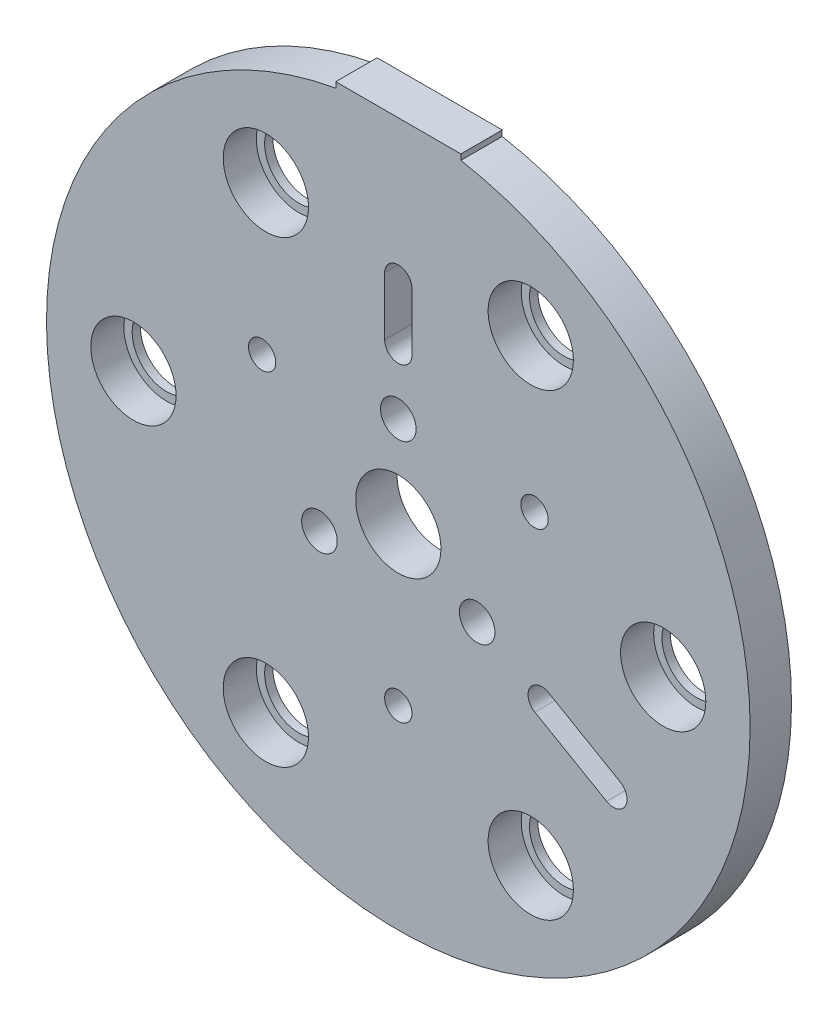
ISO-10303-21;
HEADER;
FILE_DESCRIPTION(('STEP AP214'),'2;1');
FILE_NAME('part.step','',(''),(''),'','','');
FILE_SCHEMA(('AUTOMOTIVE_DESIGN { 1 0 10303 214 1 1 1 1 }'));
ENDSEC;
DATA;
#1=APPLICATION_CONTEXT('core data for automotive mechanical design processes');
#2=APPLICATION_PROTOCOL_DEFINITION('international standard','automotive_design',2000,#1);
#3=PRODUCT_CONTEXT('',#1,'mechanical');
#4=PRODUCT('Part','Part','',(#3));
#5=PRODUCT_RELATED_PRODUCT_CATEGORY('part','',(#4));
#6=PRODUCT_DEFINITION_FORMATION('','',#4);
#7=PRODUCT_DEFINITION_CONTEXT('part definition',#1,'design');
#8=PRODUCT_DEFINITION('design','',#6,#7);
#9=PRODUCT_DEFINITION_SHAPE('','',#8);
#10=(LENGTH_UNIT() NAMED_UNIT(*) SI_UNIT(.MILLI.,.METRE.));
#11=(NAMED_UNIT(*) PLANE_ANGLE_UNIT() SI_UNIT($,.RADIAN.));
#12=(NAMED_UNIT(*) SI_UNIT($,.STERADIAN.) SOLID_ANGLE_UNIT());
#13=UNCERTAINTY_MEASURE_WITH_UNIT(LENGTH_MEASURE(1.E-05),#10,'distance_accuracy_value','');
#14=(GEOMETRIC_REPRESENTATION_CONTEXT(3) GLOBAL_UNCERTAINTY_ASSIGNED_CONTEXT((#13)) GLOBAL_UNIT_ASSIGNED_CONTEXT((#10,
#11,#12)) REPRESENTATION_CONTEXT('',''));
#15=CARTESIAN_POINT('',(0.,0.,0.));
#16=DIRECTION('',(0.,0.,1.));
#17=DIRECTION('',(1.,0.,0.));
#18=AXIS2_PLACEMENT_3D('',#15,#16,#17);
#19=CARTESIAN_POINT('',(0.,0.,-5.));
#20=DIRECTION('',(0.,0.,1.));
#21=DIRECTION('',(1.,0.,0.));
#22=AXIS2_PLACEMENT_3D('',#19,#20,#21);
#23=CYLINDRICAL_SURFACE('',#22,42.5);
#24=CARTESIAN_POINT('',(0.,0.,-5.));
#25=DIRECTION('',(0.,0.,1.));
#26=DIRECTION('',(1.,0.,0.));
#27=AXIS2_PLACEMENT_3D('',#24,#25,#26);
#28=CIRCLE('',#27,42.5);
#29=CARTESIAN_POINT('',(-7.55619707697775,41.8228871042385,-5.));
#30=VERTEX_POINT('',#29);
#31=CARTESIAN_POINT('',(7.55619707697775,41.8228871042385,-5.));
#32=VERTEX_POINT('',#31);
#33=EDGE_CURVE('E358',#30,#32,#28,.T.);
#34=ORIENTED_EDGE('',*,*,#33,.T.);
#35=DIRECTION('',(0.,0.,1.));
#36=VECTOR('',#35,1.);
#37=CARTESIAN_POINT('',(7.55619707697775,41.8228871042385,-5.));
#38=LINE('',#37,#36);
#39=CARTESIAN_POINT('',(7.55619707697775,41.8228871042385,0.));
#40=VERTEX_POINT('',#39);
#41=EDGE_CURVE('E192',#32,#40,#38,.T.);
#42=ORIENTED_EDGE('',*,*,#41,.T.);
#43=CARTESIAN_POINT('',(0.,0.,0.));
#44=DIRECTION('',(0.,0.,1.));
#45=DIRECTION('',(1.,0.,0.));
#46=AXIS2_PLACEMENT_3D('',#43,#44,#45);
#47=CIRCLE('',#46,42.5);
#48=CARTESIAN_POINT('',(-7.55619707697775,41.8228871042385,0.));
#49=VERTEX_POINT('',#48);
#50=EDGE_CURVE('E343',#49,#40,#47,.T.);
#51=ORIENTED_EDGE('',*,*,#50,.F.);
#52=DIRECTION('',(0.,0.,1.));
#53=VECTOR('',#52,1.);
#54=CARTESIAN_POINT('',(-7.55619707697775,41.8228871042385,-5.));
#55=LINE('',#54,#53);
#56=EDGE_CURVE('E190',#49,#30,#55,.F.);
#57=ORIENTED_EDGE('',*,*,#56,.T.);
#58=EDGE_LOOP('',(#34,#42,#51,#57));
#59=FACE_BOUND('',#58,.T.);
#60=ADVANCED_FACE('F79',(#59),#23,.T.);
#61=CARTESIAN_POINT('',(32.,0.,-5.));
#62=DIRECTION('',(0.,0.,1.));
#63=DIRECTION('',(1.,0.,0.));
#64=AXIS2_PLACEMENT_3D('',#61,#62,#63);
#65=CYLINDRICAL_SURFACE('',#64,5.15);
#66=CARTESIAN_POINT('',(32.,0.,0.));
#67=DIRECTION('',(0.,0.,1.));
#68=DIRECTION('',(1.,0.,0.));
#69=AXIS2_PLACEMENT_3D('',#66,#67,#68);
#70=CIRCLE('',#69,5.15);
#71=CARTESIAN_POINT('',(37.15,0.,0.));
#72=VERTEX_POINT('',#71);
#73=EDGE_CURVE('E353',#72,#72,#70,.T.);
#74=ORIENTED_EDGE('',*,*,#73,.T.);
#75=EDGE_LOOP('',(#74));
#76=FACE_BOUND('',#75,.T.);
#77=CARTESIAN_POINT('',(32.,0.,-4.));
#78=DIRECTION('',(0.,0.,-1.));
#79=DIRECTION('',(-1.,0.,0.));
#80=AXIS2_PLACEMENT_3D('',#77,#78,#79);
#81=CIRCLE('',#80,5.15);
#82=CARTESIAN_POINT('',(26.85,0.,-4.));
#83=VERTEX_POINT('',#82);
#84=EDGE_CURVE('E12',#83,#83,#81,.F.);
#85=ORIENTED_EDGE('',*,*,#84,.F.);
#86=EDGE_LOOP('',(#85));
#87=FACE_BOUND('',#86,.T.);
#88=ADVANCED_FACE('F381',(#76,#87),#65,.F.);
#89=CARTESIAN_POINT('',(16.,-27.712812921102,-5.));
#90=DIRECTION('',(0.,0.,1.));
#91=DIRECTION('',(1.,0.,0.));
#92=AXIS2_PLACEMENT_3D('',#89,#90,#91);
#93=CYLINDRICAL_SURFACE('',#92,5.15);
#94=CARTESIAN_POINT('',(16.,-27.712812921102,0.));
#95=DIRECTION('',(0.,0.,1.));
#96=DIRECTION('',(1.,0.,0.));
#97=AXIS2_PLACEMENT_3D('',#94,#95,#96);
#98=CIRCLE('',#97,5.15);
#99=CARTESIAN_POINT('',(21.15,-27.712812921102,0.));
#100=VERTEX_POINT('',#99);
#101=EDGE_CURVE('E347',#100,#100,#98,.T.);
#102=ORIENTED_EDGE('',*,*,#101,.T.);
#103=EDGE_LOOP('',(#102));
#104=FACE_BOUND('',#103,.T.);
#105=CARTESIAN_POINT('',(16.,-27.712812921102,-4.));
#106=DIRECTION('',(0.,0.,-1.));
#107=DIRECTION('',(-1.,0.,0.));
#108=AXIS2_PLACEMENT_3D('',#105,#106,#107);
#109=CIRCLE('',#108,5.15);
#110=CARTESIAN_POINT('',(10.85,-27.712812921102,-4.));
#111=VERTEX_POINT('',#110);
#112=EDGE_CURVE('E86',#111,#111,#109,.F.);
#113=ORIENTED_EDGE('',*,*,#112,.F.);
#114=EDGE_LOOP('',(#113));
#115=FACE_BOUND('',#114,.T.);
#116=ADVANCED_FACE('F378',(#104,#115),#93,.F.);
#117=CARTESIAN_POINT('',(-16.,-27.712812921102,-5.));
#118=DIRECTION('',(0.,0.,1.));
#119=DIRECTION('',(1.,0.,0.));
#120=AXIS2_PLACEMENT_3D('',#117,#118,#119);
#121=CYLINDRICAL_SURFACE('',#120,5.15);
#122=CARTESIAN_POINT('',(-16.,-27.712812921102,0.));
#123=DIRECTION('',(0.,0.,1.));
#124=DIRECTION('',(1.,0.,0.));
#125=AXIS2_PLACEMENT_3D('',#122,#123,#124);
#126=CIRCLE('',#125,5.15);
#127=CARTESIAN_POINT('',(-10.85,-27.712812921102,0.));
#128=VERTEX_POINT('',#127);
#129=EDGE_CURVE('E337',#128,#128,#126,.T.);
#130=ORIENTED_EDGE('',*,*,#129,.T.);
#131=EDGE_LOOP('',(#130));
#132=FACE_BOUND('',#131,.T.);
#133=CARTESIAN_POINT('',(-16.,-27.712812921102,-4.));
#134=DIRECTION('',(0.,0.,-1.));
#135=DIRECTION('',(-1.,0.,0.));
#136=AXIS2_PLACEMENT_3D('',#133,#134,#135);
#137=CIRCLE('',#136,5.15);
#138=CARTESIAN_POINT('',(-21.15,-27.712812921102,-4.));
#139=VERTEX_POINT('',#138);
#140=EDGE_CURVE('E371',#139,#139,#137,.F.);
#141=ORIENTED_EDGE('',*,*,#140,.F.);
#142=EDGE_LOOP('',(#141));
#143=FACE_BOUND('',#142,.T.);
#144=ADVANCED_FACE('F380',(#132,#143),#121,.F.);
#145=CARTESIAN_POINT('',(-32.,0.,-5.));
#146=DIRECTION('',(0.,0.,1.));
#147=DIRECTION('',(1.,0.,0.));
#148=AXIS2_PLACEMENT_3D('',#145,#146,#147);
#149=CYLINDRICAL_SURFACE('',#148,5.15);
#150=CARTESIAN_POINT('',(-32.,0.,0.));
#151=DIRECTION('',(0.,0.,1.));
#152=DIRECTION('',(1.,0.,0.));
#153=AXIS2_PLACEMENT_3D('',#150,#151,#152);
#154=CIRCLE('',#153,5.15);
#155=CARTESIAN_POINT('',(-26.85,0.,0.));
#156=VERTEX_POINT('',#155);
#157=EDGE_CURVE('E340',#156,#156,#154,.T.);
#158=ORIENTED_EDGE('',*,*,#157,.T.);
#159=EDGE_LOOP('',(#158));
#160=FACE_BOUND('',#159,.T.);
#161=CARTESIAN_POINT('',(-32.,0.,-4.));
#162=DIRECTION('',(0.,0.,-1.));
#163=DIRECTION('',(-1.,0.,0.));
#164=AXIS2_PLACEMENT_3D('',#161,#162,#163);
#165=CIRCLE('',#164,5.15);
#166=CARTESIAN_POINT('',(-37.15,0.,-4.));
#167=VERTEX_POINT('',#166);
#168=EDGE_CURVE('E368',#167,#167,#165,.F.);
#169=ORIENTED_EDGE('',*,*,#168,.F.);
#170=EDGE_LOOP('',(#169));
#171=FACE_BOUND('',#170,.T.);
#172=ADVANCED_FACE('F388',(#160,#171),#149,.F.);
#173=CARTESIAN_POINT('',(-16.,27.712812921102,-5.));
#174=DIRECTION('',(0.,0.,1.));
#175=DIRECTION('',(1.,0.,0.));
#176=AXIS2_PLACEMENT_3D('',#173,#174,#175);
#177=CYLINDRICAL_SURFACE('',#176,5.15);
#178=CARTESIAN_POINT('',(-16.,27.712812921102,0.));
#179=DIRECTION('',(0.,0.,1.));
#180=DIRECTION('',(1.,0.,0.));
#181=AXIS2_PLACEMENT_3D('',#178,#179,#180);
#182=CIRCLE('',#181,5.15);
#183=CARTESIAN_POINT('',(-10.85,27.712812921102,0.));
#184=VERTEX_POINT('',#183);
#185=EDGE_CURVE('E344',#184,#184,#182,.T.);
#186=ORIENTED_EDGE('',*,*,#185,.T.);
#187=EDGE_LOOP('',(#186));
#188=FACE_BOUND('',#187,.T.);
#189=CARTESIAN_POINT('',(-16.,27.712812921102,-4.));
#190=DIRECTION('',(0.,0.,-1.));
#191=DIRECTION('',(-1.,0.,0.));
#192=AXIS2_PLACEMENT_3D('',#189,#190,#191);
#193=CIRCLE('',#192,5.15);
#194=CARTESIAN_POINT('',(-21.15,27.712812921102,-4.));
#195=VERTEX_POINT('',#194);
#196=EDGE_CURVE('E365',#195,#195,#193,.F.);
#197=ORIENTED_EDGE('',*,*,#196,.F.);
#198=EDGE_LOOP('',(#197));
#199=FACE_BOUND('',#198,.T.);
#200=ADVANCED_FACE('F525',(#188,#199),#177,.F.);
#201=CARTESIAN_POINT('',(16.,27.712812921102,-5.));
#202=DIRECTION('',(0.,0.,1.));
#203=DIRECTION('',(1.,0.,0.));
#204=AXIS2_PLACEMENT_3D('',#201,#202,#203);
#205=CYLINDRICAL_SURFACE('',#204,5.15);
#206=CARTESIAN_POINT('',(16.,27.712812921102,0.));
#207=DIRECTION('',(0.,0.,1.));
#208=DIRECTION('',(1.,0.,0.));
#209=AXIS2_PLACEMENT_3D('',#206,#207,#208);
#210=CIRCLE('',#209,5.15);
#211=CARTESIAN_POINT('',(21.15,27.712812921102,0.));
#212=VERTEX_POINT('',#211);
#213=EDGE_CURVE('E350',#212,#212,#210,.T.);
#214=ORIENTED_EDGE('',*,*,#213,.T.);
#215=EDGE_LOOP('',(#214));
#216=FACE_BOUND('',#215,.T.);
#217=CARTESIAN_POINT('',(16.,27.712812921102,-4.));
#218=DIRECTION('',(0.,0.,-1.));
#219=DIRECTION('',(-1.,0.,0.));
#220=AXIS2_PLACEMENT_3D('',#217,#218,#219);
#221=CIRCLE('',#220,5.15);
#222=CARTESIAN_POINT('',(10.85,27.712812921102,-4.));
#223=VERTEX_POINT('',#222);
#224=EDGE_CURVE('E361',#223,#223,#221,.F.);
#225=ORIENTED_EDGE('',*,*,#224,.F.);
#226=EDGE_LOOP('',(#225));
#227=FACE_BOUND('',#226,.T.);
#228=ADVANCED_FACE('F530',(#216,#227),#205,.F.);
#229=CARTESIAN_POINT('',(0.,0.,-5.));
#230=DIRECTION('',(0.,0.,1.));
#231=DIRECTION('',(1.,0.,0.));
#232=AXIS2_PLACEMENT_3D('',#229,#230,#231);
#233=PLANE('',#232);
#234=ORIENTED_EDGE('',*,*,#33,.F.);
#235=DIRECTION('',(0.,-1.,0.));
#236=VECTOR('',#235,1.);
#237=CARTESIAN_POINT('',(-7.55619707697775,42.5,-5.));
#238=LINE('',#237,#236);
#239=CARTESIAN_POINT('',(-7.55619707697775,42.5,-5.));
#240=VERTEX_POINT('',#239);
#241=EDGE_CURVE('E186',#240,#30,#238,.T.);
#242=ORIENTED_EDGE('',*,*,#241,.F.);
#243=DIRECTION('',(-1.,0.,0.));
#244=VECTOR('',#243,1.);
#245=CARTESIAN_POINT('',(7.55619707697775,42.5,-5.));
#246=LINE('',#245,#244);
#247=CARTESIAN_POINT('',(7.55619707697775,42.5,-5.));
#248=VERTEX_POINT('',#247);
#249=EDGE_CURVE('E183',#248,#240,#246,.T.);
#250=ORIENTED_EDGE('',*,*,#249,.F.);
#251=DIRECTION('',(0.,1.,0.));
#252=VECTOR('',#251,1.);
#253=CARTESIAN_POINT('',(7.55619707697775,41.5,-5.));
#254=LINE('',#253,#252);
#255=EDGE_CURVE('E197',#32,#248,#254,.T.);
#256=ORIENTED_EDGE('',*,*,#255,.F.);
#257=EDGE_LOOP('',(#234,#242,#250,#256));
#258=FACE_BOUND('',#257,.T.);
#259=CARTESIAN_POINT('',(32.,0.,-5.));
#260=DIRECTION('',(0.,0.,-1.));
#261=DIRECTION('',(-1.,0.,0.));
#262=AXIS2_PLACEMENT_3D('',#259,#260,#261);
#263=CIRCLE('',#262,4.15);
#264=CARTESIAN_POINT('',(27.85,0.,-5.));
#265=VERTEX_POINT('',#264);
#266=EDGE_CURVE('E298',#265,#265,#263,.T.);
#267=ORIENTED_EDGE('',*,*,#266,.F.);
#268=EDGE_LOOP('',(#267));
#269=FACE_BOUND('',#268,.T.);
#270=CARTESIAN_POINT('',(16.,-27.712812921102,-5.));
#271=DIRECTION('',(0.,0.,-1.));
#272=DIRECTION('',(-1.,0.,0.));
#273=AXIS2_PLACEMENT_3D('',#270,#271,#272);
#274=CIRCLE('',#273,4.15);
#275=CARTESIAN_POINT('',(11.85,-27.712812921102,-5.));
#276=VERTEX_POINT('',#275);
#277=EDGE_CURVE('E304',#276,#276,#274,.T.);
#278=ORIENTED_EDGE('',*,*,#277,.F.);
#279=EDGE_LOOP('',(#278));
#280=FACE_BOUND('',#279,.T.);
#281=CARTESIAN_POINT('',(-16.,-27.712812921102,-5.));
#282=DIRECTION('',(0.,0.,-1.));
#283=DIRECTION('',(-1.,0.,0.));
#284=AXIS2_PLACEMENT_3D('',#281,#282,#283);
#285=CIRCLE('',#284,4.15);
#286=CARTESIAN_POINT('',(-20.15,-27.712812921102,-5.));
#287=VERTEX_POINT('',#286);
#288=EDGE_CURVE('E310',#287,#287,#285,.T.);
#289=ORIENTED_EDGE('',*,*,#288,.F.);
#290=EDGE_LOOP('',(#289));
#291=FACE_BOUND('',#290,.T.);
#292=CARTESIAN_POINT('',(-32.,0.,-5.));
#293=DIRECTION('',(0.,0.,-1.));
#294=DIRECTION('',(-1.,0.,0.));
#295=AXIS2_PLACEMENT_3D('',#292,#293,#294);
#296=CIRCLE('',#295,4.15);
#297=CARTESIAN_POINT('',(-36.15,0.,-5.));
#298=VERTEX_POINT('',#297);
#299=EDGE_CURVE('E316',#298,#298,#296,.T.);
#300=ORIENTED_EDGE('',*,*,#299,.F.);
#301=EDGE_LOOP('',(#300));
#302=FACE_BOUND('',#301,.T.);
#303=CARTESIAN_POINT('',(-16.,27.712812921102,-5.));
#304=DIRECTION('',(0.,0.,-1.));
#305=DIRECTION('',(-1.,0.,0.));
#306=AXIS2_PLACEMENT_3D('',#303,#304,#305);
#307=CIRCLE('',#306,4.15);
#308=CARTESIAN_POINT('',(-20.15,27.712812921102,-5.));
#309=VERTEX_POINT('',#308);
#310=EDGE_CURVE('E322',#309,#309,#307,.T.);
#311=ORIENTED_EDGE('',*,*,#310,.F.);
#312=EDGE_LOOP('',(#311));
#313=FACE_BOUND('',#312,.T.);
#314=CARTESIAN_POINT('',(16.,27.712812921102,-5.));
#315=DIRECTION('',(0.,0.,-1.));
#316=DIRECTION('',(-1.,0.,0.));
#317=AXIS2_PLACEMENT_3D('',#314,#315,#316);
#318=CIRCLE('',#317,4.15);
#319=CARTESIAN_POINT('',(11.85,27.712812921102,-5.));
#320=VERTEX_POINT('',#319);
#321=EDGE_CURVE('E325',#320,#320,#318,.T.);
#322=ORIENTED_EDGE('',*,*,#321,.F.);
#323=EDGE_LOOP('',(#322));
#324=FACE_BOUND('',#323,.T.);
#325=CARTESIAN_POINT('',(0.,0.,-5.));
#326=DIRECTION('',(0.,0.,1.));
#327=DIRECTION('',(1.,0.,0.));
#328=AXIS2_PLACEMENT_3D('',#325,#326,#327);
#329=CIRCLE('',#328,5.15);
#330=CARTESIAN_POINT('',(5.15,0.,-5.));
#331=VERTEX_POINT('',#330);
#332=EDGE_CURVE('E334',#331,#331,#329,.T.);
#333=ORIENTED_EDGE('',*,*,#332,.T.);
#334=EDGE_LOOP('',(#333));
#335=FACE_BOUND('',#334,.T.);
#336=CARTESIAN_POINT('',(0.,-19.,-5.));
#337=DIRECTION('',(0.,0.,-1.));
#338=DIRECTION('',(-1.,0.,0.));
#339=AXIS2_PLACEMENT_3D('',#336,#337,#338);
#340=CIRCLE('',#339,1.65);
#341=CARTESIAN_POINT('',(-1.64999999999998,-19.,-5.));
#342=VERTEX_POINT('',#341);
#343=EDGE_CURVE('E279',#342,#342,#340,.T.);
#344=ORIENTED_EDGE('',*,*,#343,.F.);
#345=EDGE_LOOP('',(#344));
#346=FACE_BOUND('',#345,.T.);
#347=CARTESIAN_POINT('',(-16.4544826719043,9.49999999999999,-5.));
#348=DIRECTION('',(0.,0.,-1.));
#349=DIRECTION('',(-1.,0.,0.));
#350=AXIS2_PLACEMENT_3D('',#347,#348,#349);
#351=CIRCLE('',#350,1.65);
#352=CARTESIAN_POINT('',(-18.1044826719043,9.49999999999999,-5.));
#353=VERTEX_POINT('',#352);
#354=EDGE_CURVE('E290',#353,#353,#351,.T.);
#355=ORIENTED_EDGE('',*,*,#354,.F.);
#356=EDGE_LOOP('',(#355));
#357=FACE_BOUND('',#356,.T.);
#358=CARTESIAN_POINT('',(16.4544826719043,9.50000000000002,-5.));
#359=DIRECTION('',(0.,0.,-1.));
#360=DIRECTION('',(-1.,0.,0.));
#361=AXIS2_PLACEMENT_3D('',#358,#359,#360);
#362=CIRCLE('',#361,1.65);
#363=CARTESIAN_POINT('',(14.8044826719043,9.50000000000002,-5.));
#364=VERTEX_POINT('',#363);
#365=EDGE_CURVE('E280',#364,#364,#362,.T.);
#366=ORIENTED_EDGE('',*,*,#365,.F.);
#367=EDGE_LOOP('',(#366));
#368=FACE_BOUND('',#367,.T.);
#369=DIRECTION('',(0.866025403784438,-0.500000000000001,0.));
#370=VECTOR('',#369,1.);
#371=CARTESIAN_POINT('',(18.1455080756888,-8.57105808375567,-5.));
#372=LINE('',#371,#370);
#373=CARTESIAN_POINT('',(18.1455080756888,-8.57105808375567,-5.));
#374=VERTEX_POINT('',#373);
#375=CARTESIAN_POINT('',(26.8057621135332,-13.5710580837557,-5.));
#376=VERTEX_POINT('',#375);
#377=EDGE_CURVE('E258',#374,#376,#372,.T.);
#378=ORIENTED_EDGE('',*,*,#377,.F.);
#379=CARTESIAN_POINT('',(17.3205080756888,-9.99999999999999,-5.));
#380=DIRECTION('',(0.,0.,-1.));
#381=DIRECTION('',(-1.,0.,0.));
#382=AXIS2_PLACEMENT_3D('',#379,#380,#381);
#383=CIRCLE('',#382,1.65);
#384=CARTESIAN_POINT('',(16.4955080756888,-11.4289419162443,-5.));
#385=VERTEX_POINT('',#384);
#386=EDGE_CURVE('E256',#385,#374,#383,.T.);
#387=ORIENTED_EDGE('',*,*,#386,.F.);
#388=DIRECTION('',(-0.866025403784438,0.500000000000002,0.));
#389=VECTOR('',#388,1.);
#390=CARTESIAN_POINT('',(16.4955080756888,-11.4289419162443,-5.));
#391=LINE('',#390,#389);
#392=CARTESIAN_POINT('',(25.1557621135332,-16.4289419162443,-5.));
#393=VERTEX_POINT('',#392);
#394=EDGE_CURVE('E264',#393,#385,#391,.T.);
#395=ORIENTED_EDGE('',*,*,#394,.F.);
#396=CARTESIAN_POINT('',(25.9807621135332,-15.,-5.));
#397=DIRECTION('',(0.,0.,-1.));
#398=DIRECTION('',(-1.,0.,0.));
#399=AXIS2_PLACEMENT_3D('',#396,#397,#398);
#400=CIRCLE('',#399,1.65);
#401=EDGE_CURVE('E261',#376,#393,#400,.T.);
#402=ORIENTED_EDGE('',*,*,#401,.F.);
#403=EDGE_LOOP('',(#378,#387,#395,#402));
#404=FACE_BOUND('',#403,.T.);
#405=CARTESIAN_POINT('',(-9.52627944162882,-5.50000000000001,-5.));
#406=DIRECTION('',(0.,0.,-1.));
#407=DIRECTION('',(-1.,0.,0.));
#408=AXIS2_PLACEMENT_3D('',#405,#406,#407);
#409=CIRCLE('',#408,2.15);
#410=CARTESIAN_POINT('',(-11.6762794416288,-5.50000000000001,-5.));
#411=VERTEX_POINT('',#410);
#412=EDGE_CURVE('E229',#411,#411,#409,.T.);
#413=ORIENTED_EDGE('',*,*,#412,.F.);
#414=EDGE_LOOP('',(#413));
#415=FACE_BOUND('',#414,.T.);
#416=CARTESIAN_POINT('',(0.,11.,-5.));
#417=DIRECTION('',(0.,0.,-1.));
#418=DIRECTION('',(-1.,0.,0.));
#419=AXIS2_PLACEMENT_3D('',#416,#417,#418);
#420=CIRCLE('',#419,2.15);
#421=CARTESIAN_POINT('',(-2.15,11.,-5.));
#422=VERTEX_POINT('',#421);
#423=EDGE_CURVE('E240',#422,#422,#420,.T.);
#424=ORIENTED_EDGE('',*,*,#423,.F.);
#425=EDGE_LOOP('',(#424));
#426=FACE_BOUND('',#425,.T.);
#427=CARTESIAN_POINT('',(9.52627944162883,-5.5,-5.));
#428=DIRECTION('',(0.,0.,-1.));
#429=DIRECTION('',(-1.,0.,0.));
#430=AXIS2_PLACEMENT_3D('',#427,#428,#429);
#431=CIRCLE('',#430,2.15);
#432=CARTESIAN_POINT('',(7.37627944162883,-5.5,-5.));
#433=VERTEX_POINT('',#432);
#434=EDGE_CURVE('E230',#433,#433,#431,.T.);
#435=ORIENTED_EDGE('',*,*,#434,.F.);
#436=EDGE_LOOP('',(#435));
#437=FACE_BOUND('',#436,.T.);
#438=DIRECTION('',(0.,-1.,0.));
#439=VECTOR('',#438,1.);
#440=CARTESIAN_POINT('',(1.65,25.4577820288005,-5.));
#441=LINE('',#440,#439);
#442=CARTESIAN_POINT('',(1.65,25.4577820288005,-5.));
#443=VERTEX_POINT('',#442);
#444=CARTESIAN_POINT('',(1.65,18.4577820288005,-5.));
#445=VERTEX_POINT('',#444);
#446=EDGE_CURVE('E202',#443,#445,#441,.T.);
#447=ORIENTED_EDGE('',*,*,#446,.F.);
#448=CARTESIAN_POINT('',(0.,25.4577820288005,-5.));
#449=DIRECTION('',(0.,0.,1.));
#450=DIRECTION('',(1.,0.,0.));
#451=AXIS2_PLACEMENT_3D('',#448,#449,#450);
#452=CIRCLE('',#451,1.65);
#453=CARTESIAN_POINT('',(-1.65,25.4577820288005,-5.));
#454=VERTEX_POINT('',#453);
#455=EDGE_CURVE('E205',#454,#443,#452,.F.);
#456=ORIENTED_EDGE('',*,*,#455,.F.);
#457=DIRECTION('',(0.,1.,0.));
#458=VECTOR('',#457,1.);
#459=CARTESIAN_POINT('',(-1.65,25.4577820288005,-5.));
#460=LINE('',#459,#458);
#461=CARTESIAN_POINT('',(-1.65,18.4577820288005,-5.));
#462=VERTEX_POINT('',#461);
#463=EDGE_CURVE('E221',#462,#454,#460,.T.);
#464=ORIENTED_EDGE('',*,*,#463,.F.);
#465=CARTESIAN_POINT('',(0.,18.4577820288005,-5.));
#466=DIRECTION('',(0.,0.,1.));
#467=DIRECTION('',(1.,0.,0.));
#468=AXIS2_PLACEMENT_3D('',#465,#466,#467);
#469=CIRCLE('',#468,1.65);
#470=EDGE_CURVE('E93',#445,#462,#469,.F.);
#471=ORIENTED_EDGE('',*,*,#470,.F.);
#472=EDGE_LOOP('',(#447,#456,#464,#471));
#473=FACE_BOUND('',#472,.T.);
#474=ADVANCED_FACE('F403',(#258,#269,#280,#291,#302,#313,#324,#335,#346,#357,#368,#404,#415,
#426,#437,#473),#233,.F.);
#475=CARTESIAN_POINT('',(0.,0.,0.));
#476=DIRECTION('',(0.,0.,1.));
#477=DIRECTION('',(1.,0.,0.));
#478=AXIS2_PLACEMENT_3D('',#475,#476,#477);
#479=PLANE('',#478);
#480=ORIENTED_EDGE('',*,*,#50,.T.);
#481=DIRECTION('',(0.,1.,0.));
#482=VECTOR('',#481,1.);
#483=CARTESIAN_POINT('',(7.55619707697775,41.5,0.));
#484=LINE('',#483,#482);
#485=CARTESIAN_POINT('',(7.55619707697775,42.5,0.));
#486=VERTEX_POINT('',#485);
#487=EDGE_CURVE('E175',#40,#486,#484,.T.);
#488=ORIENTED_EDGE('',*,*,#487,.T.);
#489=DIRECTION('',(-1.,0.,0.));
#490=VECTOR('',#489,1.);
#491=CARTESIAN_POINT('',(7.55619707697775,42.5,0.));
#492=LINE('',#491,#490);
#493=CARTESIAN_POINT('',(-7.55619707697775,42.5,0.));
#494=VERTEX_POINT('',#493);
#495=EDGE_CURVE('E167',#486,#494,#492,.T.);
#496=ORIENTED_EDGE('',*,*,#495,.T.);
#497=DIRECTION('',(0.,-1.,0.));
#498=VECTOR('',#497,1.);
#499=CARTESIAN_POINT('',(-7.55619707697775,42.5,0.));
#500=LINE('',#499,#498);
#501=EDGE_CURVE('E173',#494,#49,#500,.T.);
#502=ORIENTED_EDGE('',*,*,#501,.T.);
#503=EDGE_LOOP('',(#480,#488,#496,#502));
#504=FACE_BOUND('',#503,.T.);
#505=CARTESIAN_POINT('',(0.,25.4577820288005,0.));
#506=DIRECTION('',(0.,0.,1.));
#507=DIRECTION('',(1.,0.,0.));
#508=AXIS2_PLACEMENT_3D('',#505,#506,#507);
#509=CIRCLE('',#508,1.65);
#510=CARTESIAN_POINT('',(1.65,25.4577820288005,0.));
#511=VERTEX_POINT('',#510);
#512=CARTESIAN_POINT('',(-1.65,25.4577820288005,0.));
#513=VERTEX_POINT('',#512);
#514=EDGE_CURVE('E101',#511,#513,#509,.T.);
#515=ORIENTED_EDGE('',*,*,#514,.F.);
#516=DIRECTION('',(0.,1.,0.));
#517=VECTOR('',#516,1.);
#518=CARTESIAN_POINT('',(1.65,25.4577820288005,0.));
#519=LINE('',#518,#517);
#520=CARTESIAN_POINT('',(1.65,18.4577820288005,0.));
#521=VERTEX_POINT('',#520);
#522=EDGE_CURVE('E215',#521,#511,#519,.T.);
#523=ORIENTED_EDGE('',*,*,#522,.F.);
#524=CARTESIAN_POINT('',(0.,18.4577820288005,0.));
#525=DIRECTION('',(0.,0.,1.));
#526=DIRECTION('',(1.,0.,0.));
#527=AXIS2_PLACEMENT_3D('',#524,#525,#526);
#528=CIRCLE('',#527,1.65);
#529=CARTESIAN_POINT('',(-1.65,18.4577820288005,0.));
#530=VERTEX_POINT('',#529);
#531=EDGE_CURVE('E212',#530,#521,#528,.T.);
#532=ORIENTED_EDGE('',*,*,#531,.F.);
#533=DIRECTION('',(0.,-1.,0.));
#534=VECTOR('',#533,1.);
#535=CARTESIAN_POINT('',(-1.65,25.4577820288005,0.));
#536=LINE('',#535,#534);
#537=EDGE_CURVE('E209',#513,#530,#536,.T.);
#538=ORIENTED_EDGE('',*,*,#537,.F.);
#539=EDGE_LOOP('',(#515,#523,#532,#538));
#540=FACE_BOUND('',#539,.T.);
#541=CARTESIAN_POINT('',(9.52627944162883,-5.5,0.));
#542=DIRECTION('',(0.,0.,1.));
#543=DIRECTION('',(1.,0.,0.));
#544=AXIS2_PLACEMENT_3D('',#541,#542,#543);
#545=CIRCLE('',#544,2.15);
#546=CARTESIAN_POINT('',(11.6762794416288,-5.5,0.));
#547=VERTEX_POINT('',#546);
#548=EDGE_CURVE('E234',#547,#547,#545,.F.);
#549=ORIENTED_EDGE('',*,*,#548,.T.);
#550=EDGE_LOOP('',(#549));
#551=FACE_BOUND('',#550,.T.);
#552=CARTESIAN_POINT('',(0.,11.,0.));
#553=DIRECTION('',(0.,0.,1.));
#554=DIRECTION('',(1.,0.,0.));
#555=AXIS2_PLACEMENT_3D('',#552,#553,#554);
#556=CIRCLE('',#555,2.15);
#557=CARTESIAN_POINT('',(2.15,11.,0.));
#558=VERTEX_POINT('',#557);
#559=EDGE_CURVE('E237',#558,#558,#556,.F.);
#560=ORIENTED_EDGE('',*,*,#559,.T.);
#561=EDGE_LOOP('',(#560));
#562=FACE_BOUND('',#561,.T.);
#563=CARTESIAN_POINT('',(-9.52627944162882,-5.50000000000001,0.));
#564=DIRECTION('',(0.,0.,1.));
#565=DIRECTION('',(1.,0.,0.));
#566=AXIS2_PLACEMENT_3D('',#563,#564,#565);
#567=CIRCLE('',#566,2.15);
#568=CARTESIAN_POINT('',(-7.37627944162882,-5.50000000000001,0.));
#569=VERTEX_POINT('',#568);
#570=EDGE_CURVE('E243',#569,#569,#567,.F.);
#571=ORIENTED_EDGE('',*,*,#570,.T.);
#572=EDGE_LOOP('',(#571));
#573=FACE_BOUND('',#572,.T.);
#574=CARTESIAN_POINT('',(17.3205080756888,-9.99999999999999,0.));
#575=DIRECTION('',(0.,0.,1.));
#576=DIRECTION('',(1.,0.,0.));
#577=AXIS2_PLACEMENT_3D('',#574,#575,#576);
#578=CIRCLE('',#577,1.65);
#579=CARTESIAN_POINT('',(16.4955080756888,-11.4289419162443,0.));
#580=VERTEX_POINT('',#579);
#581=CARTESIAN_POINT('',(18.1455080756888,-8.57105808375567,0.));
#582=VERTEX_POINT('',#581);
#583=EDGE_CURVE('E253',#580,#582,#578,.F.);
#584=ORIENTED_EDGE('',*,*,#583,.T.);
#585=DIRECTION('',(0.866025403784438,-0.500000000000001,0.));
#586=VECTOR('',#585,1.);
#587=CARTESIAN_POINT('',(18.1455080756888,-8.57105808375567,0.));
#588=LINE('',#587,#586);
#589=CARTESIAN_POINT('',(26.8057621135332,-13.5710580837557,0.));
#590=VERTEX_POINT('',#589);
#591=EDGE_CURVE('E270',#582,#590,#588,.T.);
#592=ORIENTED_EDGE('',*,*,#591,.T.);
#593=CARTESIAN_POINT('',(25.9807621135332,-15.,0.));
#594=DIRECTION('',(0.,0.,1.));
#595=DIRECTION('',(1.,0.,0.));
#596=AXIS2_PLACEMENT_3D('',#593,#594,#595);
#597=CIRCLE('',#596,1.65);
#598=CARTESIAN_POINT('',(25.1557621135332,-16.4289419162443,0.));
#599=VERTEX_POINT('',#598);
#600=EDGE_CURVE('E233',#590,#599,#597,.F.);
#601=ORIENTED_EDGE('',*,*,#600,.T.);
#602=DIRECTION('',(-0.866025403784438,0.500000000000002,0.));
#603=VECTOR('',#602,1.);
#604=CARTESIAN_POINT('',(16.4955080756888,-11.4289419162443,0.));
#605=LINE('',#604,#603);
#606=EDGE_CURVE('E250',#599,#580,#605,.T.);
#607=ORIENTED_EDGE('',*,*,#606,.T.);
#608=EDGE_LOOP('',(#584,#592,#601,#607));
#609=FACE_BOUND('',#608,.T.);
#610=CARTESIAN_POINT('',(16.4544826719043,9.50000000000002,0.));
#611=DIRECTION('',(0.,0.,1.));
#612=DIRECTION('',(1.,0.,0.));
#613=AXIS2_PLACEMENT_3D('',#610,#611,#612);
#614=CIRCLE('',#613,1.65);
#615=CARTESIAN_POINT('',(18.1044826719043,9.50000000000002,0.));
#616=VERTEX_POINT('',#615);
#617=EDGE_CURVE('E284',#616,#616,#614,.F.);
#618=ORIENTED_EDGE('',*,*,#617,.T.);
#619=EDGE_LOOP('',(#618));
#620=FACE_BOUND('',#619,.T.);
#621=CARTESIAN_POINT('',(-16.4544826719043,9.49999999999999,0.));
#622=DIRECTION('',(0.,0.,1.));
#623=DIRECTION('',(1.,0.,0.));
#624=AXIS2_PLACEMENT_3D('',#621,#622,#623);
#625=CIRCLE('',#624,1.65);
#626=CARTESIAN_POINT('',(-14.8044826719043,9.49999999999999,0.));
#627=VERTEX_POINT('',#626);
#628=EDGE_CURVE('E287',#627,#627,#625,.F.);
#629=ORIENTED_EDGE('',*,*,#628,.T.);
#630=EDGE_LOOP('',(#629));
#631=FACE_BOUND('',#630,.T.);
#632=CARTESIAN_POINT('',(0.,-19.,0.));
#633=DIRECTION('',(0.,0.,1.));
#634=DIRECTION('',(1.,0.,0.));
#635=AXIS2_PLACEMENT_3D('',#632,#633,#634);
#636=CIRCLE('',#635,1.65);
#637=CARTESIAN_POINT('',(1.65000000000002,-19.,0.));
#638=VERTEX_POINT('',#637);
#639=EDGE_CURVE('E293',#638,#638,#636,.F.);
#640=ORIENTED_EDGE('',*,*,#639,.T.);
#641=EDGE_LOOP('',(#640));
#642=FACE_BOUND('',#641,.T.);
#643=CARTESIAN_POINT('',(0.,0.,0.));
#644=DIRECTION('',(0.,0.,1.));
#645=DIRECTION('',(1.,0.,0.));
#646=AXIS2_PLACEMENT_3D('',#643,#644,#645);
#647=CIRCLE('',#646,5.15);
#648=CARTESIAN_POINT('',(5.15,0.,0.));
#649=VERTEX_POINT('',#648);
#650=EDGE_CURVE('E331',#649,#649,#647,.T.);
#651=ORIENTED_EDGE('',*,*,#650,.F.);
#652=EDGE_LOOP('',(#651));
#653=FACE_BOUND('',#652,.T.);
#654=ORIENTED_EDGE('',*,*,#157,.F.);
#655=EDGE_LOOP('',(#654));
#656=FACE_BOUND('',#655,.T.);
#657=ORIENTED_EDGE('',*,*,#129,.F.);
#658=EDGE_LOOP('',(#657));
#659=FACE_BOUND('',#658,.T.);
#660=ORIENTED_EDGE('',*,*,#101,.F.);
#661=EDGE_LOOP('',(#660));
#662=FACE_BOUND('',#661,.T.);
#663=ORIENTED_EDGE('',*,*,#73,.F.);
#664=EDGE_LOOP('',(#663));
#665=FACE_BOUND('',#664,.T.);
#666=ORIENTED_EDGE('',*,*,#213,.F.);
#667=EDGE_LOOP('',(#666));
#668=FACE_BOUND('',#667,.T.);
#669=ORIENTED_EDGE('',*,*,#185,.F.);
#670=EDGE_LOOP('',(#669));
#671=FACE_BOUND('',#670,.T.);
#672=ADVANCED_FACE('F170',(#504,#540,#551,#562,#573,#609,#620,#631,#642,#653,#656,#659,#662,
#665,#668,#671),#479,.T.);
#673=CARTESIAN_POINT('',(0.,0.,-5.));
#674=DIRECTION('',(0.,0.,1.));
#675=DIRECTION('',(1.,0.,0.));
#676=AXIS2_PLACEMENT_3D('',#673,#674,#675);
#677=CYLINDRICAL_SURFACE('',#676,5.15);
#678=ORIENTED_EDGE('',*,*,#332,.F.);
#679=EDGE_LOOP('',(#678));
#680=FACE_BOUND('',#679,.T.);
#681=ORIENTED_EDGE('',*,*,#650,.T.);
#682=EDGE_LOOP('',(#681));
#683=FACE_BOUND('',#682,.T.);
#684=ADVANCED_FACE('F519',(#680,#683),#677,.F.);
#685=CARTESIAN_POINT('',(16.,27.712812921102,-4.));
#686=DIRECTION('',(0.,0.,-1.));
#687=DIRECTION('',(-1.,0.,0.));
#688=AXIS2_PLACEMENT_3D('',#685,#686,#687);
#689=PLANE('',#688);
#690=CARTESIAN_POINT('',(16.,27.712812921102,-4.));
#691=DIRECTION('',(0.,0.,-1.));
#692=DIRECTION('',(-1.,0.,0.));
#693=AXIS2_PLACEMENT_3D('',#690,#691,#692);
#694=CIRCLE('',#693,4.15);
#695=CARTESIAN_POINT('',(11.85,27.712812921102,-4.));
#696=VERTEX_POINT('',#695);
#697=EDGE_CURVE('E328',#696,#696,#694,.T.);
#698=ORIENTED_EDGE('',*,*,#697,.T.);
#699=EDGE_LOOP('',(#698));
#700=FACE_BOUND('',#699,.T.);
#701=ORIENTED_EDGE('',*,*,#224,.T.);
#702=EDGE_LOOP('',(#701));
#703=FACE_BOUND('',#702,.T.);
#704=ADVANCED_FACE('F515',(#700,#703),#689,.F.);
#705=CARTESIAN_POINT('',(16.,27.712812921102,-4.));
#706=DIRECTION('',(0.,0.,-1.));
#707=DIRECTION('',(-1.,0.,0.));
#708=AXIS2_PLACEMENT_3D('',#705,#706,#707);
#709=CYLINDRICAL_SURFACE('',#708,4.15);
#710=ORIENTED_EDGE('',*,*,#697,.F.);
#711=EDGE_LOOP('',(#710));
#712=FACE_BOUND('',#711,.T.);
#713=ORIENTED_EDGE('',*,*,#321,.T.);
#714=EDGE_LOOP('',(#713));
#715=FACE_BOUND('',#714,.T.);
#716=ADVANCED_FACE('F508',(#712,#715),#709,.F.);
#717=CARTESIAN_POINT('',(-16.,27.712812921102,-4.));
#718=DIRECTION('',(0.,0.,-1.));
#719=DIRECTION('',(-1.,0.,0.));
#720=AXIS2_PLACEMENT_3D('',#717,#718,#719);
#721=PLANE('',#720);
#722=CARTESIAN_POINT('',(-16.,27.712812921102,-4.));
#723=DIRECTION('',(0.,0.,-1.));
#724=DIRECTION('',(-1.,0.,0.));
#725=AXIS2_PLACEMENT_3D('',#722,#723,#724);
#726=CIRCLE('',#725,4.15);
#727=CARTESIAN_POINT('',(-20.15,27.712812921102,-4.));
#728=VERTEX_POINT('',#727);
#729=EDGE_CURVE('E319',#728,#728,#726,.T.);
#730=ORIENTED_EDGE('',*,*,#729,.T.);
#731=EDGE_LOOP('',(#730));
#732=FACE_BOUND('',#731,.T.);
#733=ORIENTED_EDGE('',*,*,#196,.T.);
#734=EDGE_LOOP('',(#733));
#735=FACE_BOUND('',#734,.T.);
#736=ADVANCED_FACE('F505',(#732,#735),#721,.F.);
#737=CARTESIAN_POINT('',(-16.,27.712812921102,-4.));
#738=DIRECTION('',(0.,0.,-1.));
#739=DIRECTION('',(-1.,0.,0.));
#740=AXIS2_PLACEMENT_3D('',#737,#738,#739);
#741=CYLINDRICAL_SURFACE('',#740,4.15);
#742=ORIENTED_EDGE('',*,*,#729,.F.);
#743=EDGE_LOOP('',(#742));
#744=FACE_BOUND('',#743,.T.);
#745=ORIENTED_EDGE('',*,*,#310,.T.);
#746=EDGE_LOOP('',(#745));
#747=FACE_BOUND('',#746,.T.);
#748=ADVANCED_FACE('F500',(#744,#747),#741,.F.);
#749=CARTESIAN_POINT('',(-32.,0.,-4.));
#750=DIRECTION('',(0.,0.,-1.));
#751=DIRECTION('',(-1.,0.,0.));
#752=AXIS2_PLACEMENT_3D('',#749,#750,#751);
#753=PLANE('',#752);
#754=CARTESIAN_POINT('',(-32.,0.,-4.));
#755=DIRECTION('',(0.,0.,-1.));
#756=DIRECTION('',(-1.,0.,0.));
#757=AXIS2_PLACEMENT_3D('',#754,#755,#756);
#758=CIRCLE('',#757,4.15);
#759=CARTESIAN_POINT('',(-36.15,0.,-4.));
#760=VERTEX_POINT('',#759);
#761=EDGE_CURVE('E313',#760,#760,#758,.T.);
#762=ORIENTED_EDGE('',*,*,#761,.T.);
#763=EDGE_LOOP('',(#762));
#764=FACE_BOUND('',#763,.T.);
#765=ORIENTED_EDGE('',*,*,#168,.T.);
#766=EDGE_LOOP('',(#765));
#767=FACE_BOUND('',#766,.T.);
#768=ADVANCED_FACE('F497',(#764,#767),#753,.F.);
#769=CARTESIAN_POINT('',(-32.,0.,-4.));
#770=DIRECTION('',(0.,0.,-1.));
#771=DIRECTION('',(-1.,0.,0.));
#772=AXIS2_PLACEMENT_3D('',#769,#770,#771);
#773=CYLINDRICAL_SURFACE('',#772,4.15);
#774=ORIENTED_EDGE('',*,*,#761,.F.);
#775=EDGE_LOOP('',(#774));
#776=FACE_BOUND('',#775,.T.);
#777=ORIENTED_EDGE('',*,*,#299,.T.);
#778=EDGE_LOOP('',(#777));
#779=FACE_BOUND('',#778,.T.);
#780=ADVANCED_FACE('F492',(#776,#779),#773,.F.);
#781=CARTESIAN_POINT('',(-16.,-27.712812921102,-4.));
#782=DIRECTION('',(0.,0.,-1.));
#783=DIRECTION('',(-1.,0.,0.));
#784=AXIS2_PLACEMENT_3D('',#781,#782,#783);
#785=PLANE('',#784);
#786=CARTESIAN_POINT('',(-16.,-27.712812921102,-4.));
#787=DIRECTION('',(0.,0.,-1.));
#788=DIRECTION('',(-1.,0.,0.));
#789=AXIS2_PLACEMENT_3D('',#786,#787,#788);
#790=CIRCLE('',#789,4.15);
#791=CARTESIAN_POINT('',(-20.15,-27.712812921102,-4.));
#792=VERTEX_POINT('',#791);
#793=EDGE_CURVE('E307',#792,#792,#790,.T.);
#794=ORIENTED_EDGE('',*,*,#793,.T.);
#795=EDGE_LOOP('',(#794));
#796=FACE_BOUND('',#795,.T.);
#797=ORIENTED_EDGE('',*,*,#140,.T.);
#798=EDGE_LOOP('',(#797));
#799=FACE_BOUND('',#798,.T.);
#800=ADVANCED_FACE('F489',(#796,#799),#785,.F.);
#801=CARTESIAN_POINT('',(-16.,-27.712812921102,-4.));
#802=DIRECTION('',(0.,0.,-1.));
#803=DIRECTION('',(-1.,0.,0.));
#804=AXIS2_PLACEMENT_3D('',#801,#802,#803);
#805=CYLINDRICAL_SURFACE('',#804,4.15);
#806=ORIENTED_EDGE('',*,*,#793,.F.);
#807=EDGE_LOOP('',(#806));
#808=FACE_BOUND('',#807,.T.);
#809=ORIENTED_EDGE('',*,*,#288,.T.);
#810=EDGE_LOOP('',(#809));
#811=FACE_BOUND('',#810,.T.);
#812=ADVANCED_FACE('F484',(#808,#811),#805,.F.);
#813=CARTESIAN_POINT('',(16.,-27.712812921102,-4.));
#814=DIRECTION('',(0.,0.,-1.));
#815=DIRECTION('',(-1.,0.,0.));
#816=AXIS2_PLACEMENT_3D('',#813,#814,#815);
#817=PLANE('',#816);
#818=CARTESIAN_POINT('',(16.,-27.712812921102,-4.));
#819=DIRECTION('',(0.,0.,-1.));
#820=DIRECTION('',(-1.,0.,0.));
#821=AXIS2_PLACEMENT_3D('',#818,#819,#820);
#822=CIRCLE('',#821,4.15);
#823=CARTESIAN_POINT('',(11.85,-27.712812921102,-4.));
#824=VERTEX_POINT('',#823);
#825=EDGE_CURVE('E301',#824,#824,#822,.T.);
#826=ORIENTED_EDGE('',*,*,#825,.T.);
#827=EDGE_LOOP('',(#826));
#828=FACE_BOUND('',#827,.T.);
#829=ORIENTED_EDGE('',*,*,#112,.T.);
#830=EDGE_LOOP('',(#829));
#831=FACE_BOUND('',#830,.T.);
#832=ADVANCED_FACE('F376',(#828,#831),#817,.F.);
#833=CARTESIAN_POINT('',(16.,-27.712812921102,-4.));
#834=DIRECTION('',(0.,0.,-1.));
#835=DIRECTION('',(-1.,0.,0.));
#836=AXIS2_PLACEMENT_3D('',#833,#834,#835);
#837=CYLINDRICAL_SURFACE('',#836,4.15);
#838=ORIENTED_EDGE('',*,*,#825,.F.);
#839=EDGE_LOOP('',(#838));
#840=FACE_BOUND('',#839,.T.);
#841=ORIENTED_EDGE('',*,*,#277,.T.);
#842=EDGE_LOOP('',(#841));
#843=FACE_BOUND('',#842,.T.);
#844=ADVANCED_FACE('F477',(#840,#843),#837,.F.);
#845=CARTESIAN_POINT('',(32.,0.,-4.));
#846=DIRECTION('',(0.,0.,-1.));
#847=DIRECTION('',(-1.,0.,0.));
#848=AXIS2_PLACEMENT_3D('',#845,#846,#847);
#849=PLANE('',#848);
#850=CARTESIAN_POINT('',(32.,0.,-4.));
#851=DIRECTION('',(0.,0.,-1.));
#852=DIRECTION('',(-1.,0.,0.));
#853=AXIS2_PLACEMENT_3D('',#850,#851,#852);
#854=CIRCLE('',#853,4.15);
#855=CARTESIAN_POINT('',(27.85,0.,-4.));
#856=VERTEX_POINT('',#855);
#857=EDGE_CURVE('E283',#856,#856,#854,.T.);
#858=ORIENTED_EDGE('',*,*,#857,.T.);
#859=EDGE_LOOP('',(#858));
#860=FACE_BOUND('',#859,.T.);
#861=ORIENTED_EDGE('',*,*,#84,.T.);
#862=EDGE_LOOP('',(#861));
#863=FACE_BOUND('',#862,.T.);
#864=ADVANCED_FACE('F474',(#860,#863),#849,.F.);
#865=CARTESIAN_POINT('',(32.,0.,-4.));
#866=DIRECTION('',(0.,0.,-1.));
#867=DIRECTION('',(-1.,0.,0.));
#868=AXIS2_PLACEMENT_3D('',#865,#866,#867);
#869=CYLINDRICAL_SURFACE('',#868,4.15);
#870=ORIENTED_EDGE('',*,*,#857,.F.);
#871=EDGE_LOOP('',(#870));
#872=FACE_BOUND('',#871,.T.);
#873=ORIENTED_EDGE('',*,*,#266,.T.);
#874=EDGE_LOOP('',(#873));
#875=FACE_BOUND('',#874,.T.);
#876=ADVANCED_FACE('F472',(#872,#875),#869,.F.);
#877=CARTESIAN_POINT('',(0.,-19.,0.00100000000000013));
#878=DIRECTION('',(0.,0.,-1.));
#879=DIRECTION('',(-1.,0.,0.));
#880=AXIS2_PLACEMENT_3D('',#877,#878,#879);
#881=CYLINDRICAL_SURFACE('',#880,1.65);
#882=ORIENTED_EDGE('',*,*,#639,.F.);
#883=EDGE_LOOP('',(#882));
#884=FACE_BOUND('',#883,.T.);
#885=ORIENTED_EDGE('',*,*,#343,.T.);
#886=EDGE_LOOP('',(#885));
#887=FACE_BOUND('',#886,.T.);
#888=ADVANCED_FACE('F468',(#884,#887),#881,.F.);
#889=CARTESIAN_POINT('',(-16.4544826719043,9.49999999999999,0.00100000000000013));
#890=DIRECTION('',(0.,0.,-1.));
#891=DIRECTION('',(-1.,0.,0.));
#892=AXIS2_PLACEMENT_3D('',#889,#890,#891);
#893=CYLINDRICAL_SURFACE('',#892,1.65);
#894=ORIENTED_EDGE('',*,*,#628,.F.);
#895=EDGE_LOOP('',(#894));
#896=FACE_BOUND('',#895,.T.);
#897=ORIENTED_EDGE('',*,*,#354,.T.);
#898=EDGE_LOOP('',(#897));
#899=FACE_BOUND('',#898,.T.);
#900=ADVANCED_FACE('F464',(#896,#899),#893,.F.);
#901=CARTESIAN_POINT('',(16.4544826719043,9.50000000000002,0.00100000000000013));
#902=DIRECTION('',(0.,0.,-1.));
#903=DIRECTION('',(-1.,0.,0.));
#904=AXIS2_PLACEMENT_3D('',#901,#902,#903);
#905=CYLINDRICAL_SURFACE('',#904,1.65);
#906=ORIENTED_EDGE('',*,*,#617,.F.);
#907=EDGE_LOOP('',(#906));
#908=FACE_BOUND('',#907,.T.);
#909=ORIENTED_EDGE('',*,*,#365,.T.);
#910=EDGE_LOOP('',(#909));
#911=FACE_BOUND('',#910,.T.);
#912=ADVANCED_FACE('F460',(#908,#911),#905,.F.);
#913=CARTESIAN_POINT('',(17.3205080756888,-9.99999999999999,0.00100000000000013));
#914=DIRECTION('',(0.,0.,-1.));
#915=DIRECTION('',(-1.,0.,0.));
#916=AXIS2_PLACEMENT_3D('',#913,#914,#915);
#917=CYLINDRICAL_SURFACE('',#916,1.65);
#918=DIRECTION('',(0.,0.,-1.));
#919=VECTOR('',#918,1.);
#920=CARTESIAN_POINT('',(16.4955080756888,-11.4289419162443,0.00100000000000013));
#921=LINE('',#920,#919);
#922=EDGE_CURVE('E268',#580,#385,#921,.T.);
#923=ORIENTED_EDGE('',*,*,#922,.T.);
#924=ORIENTED_EDGE('',*,*,#386,.T.);
#925=DIRECTION('',(0.,0.,-1.));
#926=VECTOR('',#925,1.);
#927=CARTESIAN_POINT('',(18.1455080756888,-8.57105808375567,0.00100000000000013));
#928=LINE('',#927,#926);
#929=EDGE_CURVE('E267',#582,#374,#928,.T.);
#930=ORIENTED_EDGE('',*,*,#929,.F.);
#931=ORIENTED_EDGE('',*,*,#583,.F.);
#932=EDGE_LOOP('',(#923,#924,#930,#931));
#933=FACE_BOUND('',#932,.T.);
#934=ADVANCED_FACE('F450',(#933),#917,.F.);
#935=CARTESIAN_POINT('',(16.4955080756888,-11.4289419162443,0.00100000000000013));
#936=DIRECTION('',(-0.500000000000002,-0.866025403784438,0.));
#937=DIRECTION('',(0.866025403784438,-0.500000000000002,0.));
#938=AXIS2_PLACEMENT_3D('',#935,#936,#937);
#939=PLANE('',#938);
#940=DIRECTION('',(0.,0.,-1.));
#941=VECTOR('',#940,1.);
#942=CARTESIAN_POINT('',(25.1557621135332,-16.4289419162443,0.00100000000000013));
#943=LINE('',#942,#941);
#944=EDGE_CURVE('E271',#599,#393,#943,.T.);
#945=ORIENTED_EDGE('',*,*,#944,.T.);
#946=ORIENTED_EDGE('',*,*,#394,.T.);
#947=ORIENTED_EDGE('',*,*,#922,.F.);
#948=ORIENTED_EDGE('',*,*,#606,.F.);
#949=EDGE_LOOP('',(#945,#946,#947,#948));
#950=FACE_BOUND('',#949,.T.);
#951=ADVANCED_FACE('F446',(#950),#939,.F.);
#952=CARTESIAN_POINT('',(25.9807621135332,-15.,0.00100000000000013));
#953=DIRECTION('',(0.,0.,-1.));
#954=DIRECTION('',(-1.,0.,0.));
#955=AXIS2_PLACEMENT_3D('',#952,#953,#954);
#956=CYLINDRICAL_SURFACE('',#955,1.65);
#957=DIRECTION('',(0.,0.,-1.));
#958=VECTOR('',#957,1.);
#959=CARTESIAN_POINT('',(26.8057621135332,-13.5710580837557,0.00100000000000013));
#960=LINE('',#959,#958);
#961=EDGE_CURVE('E273',#590,#376,#960,.T.);
#962=ORIENTED_EDGE('',*,*,#961,.T.);
#963=ORIENTED_EDGE('',*,*,#401,.T.);
#964=ORIENTED_EDGE('',*,*,#944,.F.);
#965=ORIENTED_EDGE('',*,*,#600,.F.);
#966=EDGE_LOOP('',(#962,#963,#964,#965));
#967=FACE_BOUND('',#966,.T.);
#968=ADVANCED_FACE('F449',(#967),#956,.F.);
#969=CARTESIAN_POINT('',(18.1455080756888,-8.57105808375567,0.00100000000000013));
#970=DIRECTION('',(0.500000000000001,0.866025403784438,0.));
#971=DIRECTION('',(-0.866025403784438,0.500000000000001,0.));
#972=AXIS2_PLACEMENT_3D('',#969,#970,#971);
#973=PLANE('',#972);
#974=ORIENTED_EDGE('',*,*,#929,.T.);
#975=ORIENTED_EDGE('',*,*,#377,.T.);
#976=ORIENTED_EDGE('',*,*,#961,.F.);
#977=ORIENTED_EDGE('',*,*,#591,.F.);
#978=EDGE_LOOP('',(#974,#975,#976,#977));
#979=FACE_BOUND('',#978,.T.);
#980=ADVANCED_FACE('F444',(#979),#973,.F.);
#981=CARTESIAN_POINT('',(-9.52627944162882,-5.50000000000001,0.00100000000000013));
#982=DIRECTION('',(0.,0.,-1.));
#983=DIRECTION('',(-1.,0.,0.));
#984=AXIS2_PLACEMENT_3D('',#981,#982,#983);
#985=CYLINDRICAL_SURFACE('',#984,2.15);
#986=ORIENTED_EDGE('',*,*,#570,.F.);
#987=EDGE_LOOP('',(#986));
#988=FACE_BOUND('',#987,.T.);
#989=ORIENTED_EDGE('',*,*,#412,.T.);
#990=EDGE_LOOP('',(#989));
#991=FACE_BOUND('',#990,.T.);
#992=ADVANCED_FACE('F440',(#988,#991),#985,.F.);
#993=CARTESIAN_POINT('',(0.,11.,0.00100000000000013));
#994=DIRECTION('',(0.,0.,-1.));
#995=DIRECTION('',(-1.,0.,0.));
#996=AXIS2_PLACEMENT_3D('',#993,#994,#995);
#997=CYLINDRICAL_SURFACE('',#996,2.15);
#998=ORIENTED_EDGE('',*,*,#559,.F.);
#999=EDGE_LOOP('',(#998));
#1000=FACE_BOUND('',#999,.T.);
#1001=ORIENTED_EDGE('',*,*,#423,.T.);
#1002=EDGE_LOOP('',(#1001));
#1003=FACE_BOUND('',#1002,.T.);
#1004=ADVANCED_FACE('F436',(#1000,#1003),#997,.F.);
#1005=CARTESIAN_POINT('',(9.52627944162883,-5.5,0.00100000000000013));
#1006=DIRECTION('',(0.,0.,-1.));
#1007=DIRECTION('',(-1.,0.,0.));
#1008=AXIS2_PLACEMENT_3D('',#1005,#1006,#1007);
#1009=CYLINDRICAL_SURFACE('',#1008,2.15);
#1010=ORIENTED_EDGE('',*,*,#548,.F.);
#1011=EDGE_LOOP('',(#1010));
#1012=FACE_BOUND('',#1011,.T.);
#1013=ORIENTED_EDGE('',*,*,#434,.T.);
#1014=EDGE_LOOP('',(#1013));
#1015=FACE_BOUND('',#1014,.T.);
#1016=ADVANCED_FACE('F433',(#1012,#1015),#1009,.F.);
#1017=CARTESIAN_POINT('',(0.,25.4577820288005,-5.001));
#1018=DIRECTION('',(0.,0.,1.));
#1019=DIRECTION('',(1.,0.,0.));
#1020=AXIS2_PLACEMENT_3D('',#1017,#1018,#1019);
#1021=CYLINDRICAL_SURFACE('',#1020,1.65);
#1022=ORIENTED_EDGE('',*,*,#455,.T.);
#1023=DIRECTION('',(0.,0.,1.));
#1024=VECTOR('',#1023,1.);
#1025=CARTESIAN_POINT('',(1.65,25.4577820288005,-5.001));
#1026=LINE('',#1025,#1024);
#1027=EDGE_CURVE('E219',#443,#511,#1026,.T.);
#1028=ORIENTED_EDGE('',*,*,#1027,.T.);
#1029=ORIENTED_EDGE('',*,*,#514,.T.);
#1030=DIRECTION('',(0.,0.,1.));
#1031=VECTOR('',#1030,1.);
#1032=CARTESIAN_POINT('',(-1.65,25.4577820288005,-5.001));
#1033=LINE('',#1032,#1031);
#1034=EDGE_CURVE('E218',#454,#513,#1033,.T.);
#1035=ORIENTED_EDGE('',*,*,#1034,.F.);
#1036=EDGE_LOOP('',(#1022,#1028,#1029,#1035));
#1037=FACE_BOUND('',#1036,.T.);
#1038=ADVANCED_FACE('F425',(#1037),#1021,.F.);
#1039=CARTESIAN_POINT('',(1.65,25.4577820288005,-5.001));
#1040=DIRECTION('',(1.,0.,0.));
#1041=DIRECTION('',(0.,1.,0.));
#1042=AXIS2_PLACEMENT_3D('',#1039,#1040,#1041);
#1043=PLANE('',#1042);
#1044=ORIENTED_EDGE('',*,*,#446,.T.);
#1045=DIRECTION('',(0.,0.,1.));
#1046=VECTOR('',#1045,1.);
#1047=CARTESIAN_POINT('',(1.65,18.4577820288005,-5.001));
#1048=LINE('',#1047,#1046);
#1049=EDGE_CURVE('E222',#445,#521,#1048,.T.);
#1050=ORIENTED_EDGE('',*,*,#1049,.T.);
#1051=ORIENTED_EDGE('',*,*,#522,.T.);
#1052=ORIENTED_EDGE('',*,*,#1027,.F.);
#1053=EDGE_LOOP('',(#1044,#1050,#1051,#1052));
#1054=FACE_BOUND('',#1053,.T.);
#1055=ADVANCED_FACE('F421',(#1054),#1043,.F.);
#1056=CARTESIAN_POINT('',(0.,18.4577820288005,-5.001));
#1057=DIRECTION('',(0.,0.,1.));
#1058=DIRECTION('',(1.,0.,0.));
#1059=AXIS2_PLACEMENT_3D('',#1056,#1057,#1058);
#1060=CYLINDRICAL_SURFACE('',#1059,1.65);
#1061=ORIENTED_EDGE('',*,*,#470,.T.);
#1062=DIRECTION('',(0.,0.,1.));
#1063=VECTOR('',#1062,1.);
#1064=CARTESIAN_POINT('',(-1.65,18.4577820288005,-5.001));
#1065=LINE('',#1064,#1063);
#1066=EDGE_CURVE('E224',#462,#530,#1065,.T.);
#1067=ORIENTED_EDGE('',*,*,#1066,.T.);
#1068=ORIENTED_EDGE('',*,*,#531,.T.);
#1069=ORIENTED_EDGE('',*,*,#1049,.F.);
#1070=EDGE_LOOP('',(#1061,#1067,#1068,#1069));
#1071=FACE_BOUND('',#1070,.T.);
#1072=ADVANCED_FACE('F424',(#1071),#1060,.F.);
#1073=CARTESIAN_POINT('',(-1.65,25.4577820288005,-5.001));
#1074=DIRECTION('',(-1.,0.,0.));
#1075=DIRECTION('',(0.,-1.,0.));
#1076=AXIS2_PLACEMENT_3D('',#1073,#1074,#1075);
#1077=PLANE('',#1076);
#1078=ORIENTED_EDGE('',*,*,#463,.T.);
#1079=ORIENTED_EDGE('',*,*,#1034,.T.);
#1080=ORIENTED_EDGE('',*,*,#537,.T.);
#1081=ORIENTED_EDGE('',*,*,#1066,.F.);
#1082=EDGE_LOOP('',(#1078,#1079,#1080,#1081));
#1083=FACE_BOUND('',#1082,.T.);
#1084=ADVANCED_FACE('F418',(#1083),#1077,.F.);
#1085=CARTESIAN_POINT('',(7.55619707697775,42.5,15.1454434423198));
#1086=DIRECTION('',(0.,-1.,0.));
#1087=DIRECTION('',(0.,0.,-1.));
#1088=AXIS2_PLACEMENT_3D('',#1085,#1086,#1087);
#1089=PLANE('',#1088);
#1090=ORIENTED_EDGE('',*,*,#495,.F.);
#1091=DIRECTION('',(0.,0.,-1.));
#1092=VECTOR('',#1091,1.);
#1093=CARTESIAN_POINT('',(7.55619707697775,42.5,15.1454434423198));
#1094=LINE('',#1093,#1092);
#1095=EDGE_CURVE('E196',#486,#248,#1094,.T.);
#1096=ORIENTED_EDGE('',*,*,#1095,.T.);
#1097=ORIENTED_EDGE('',*,*,#249,.T.);
#1098=DIRECTION('',(0.,0.,-1.));
#1099=VECTOR('',#1098,1.);
#1100=CARTESIAN_POINT('',(-7.55619707697775,42.5,15.1454434423198));
#1101=LINE('',#1100,#1099);
#1102=EDGE_CURVE('E181',#494,#240,#1101,.T.);
#1103=ORIENTED_EDGE('',*,*,#1102,.F.);
#1104=EDGE_LOOP('',(#1090,#1096,#1097,#1103));
#1105=FACE_BOUND('',#1104,.T.);
#1106=ADVANCED_FACE('F182',(#1105),#1089,.F.);
#1107=CARTESIAN_POINT('',(7.55619707697775,41.5,15.1454434423198));
#1108=DIRECTION('',(-1.,0.,0.));
#1109=DIRECTION('',(0.,0.,1.));
#1110=AXIS2_PLACEMENT_3D('',#1107,#1108,#1109);
#1111=PLANE('',#1110);
#1112=ORIENTED_EDGE('',*,*,#41,.F.);
#1113=ORIENTED_EDGE('',*,*,#255,.T.);
#1114=ORIENTED_EDGE('',*,*,#1095,.F.);
#1115=ORIENTED_EDGE('',*,*,#487,.F.);
#1116=EDGE_LOOP('',(#1112,#1113,#1114,#1115));
#1117=FACE_BOUND('',#1116,.T.);
#1118=ADVANCED_FACE('F410',(#1117),#1111,.F.);
#1119=CARTESIAN_POINT('',(-7.55619707697775,42.5,15.1454434423198));
#1120=DIRECTION('',(1.,0.,0.));
#1121=DIRECTION('',(0.,0.,-1.));
#1122=AXIS2_PLACEMENT_3D('',#1119,#1120,#1121);
#1123=PLANE('',#1122);
#1124=ORIENTED_EDGE('',*,*,#56,.F.);
#1125=ORIENTED_EDGE('',*,*,#501,.F.);
#1126=ORIENTED_EDGE('',*,*,#1102,.T.);
#1127=ORIENTED_EDGE('',*,*,#241,.T.);
#1128=EDGE_LOOP('',(#1124,#1125,#1126,#1127));
#1129=FACE_BOUND('',#1128,.T.);
#1130=ADVANCED_FACE('F188',(#1129),#1123,.F.);
#1131=CLOSED_SHELL('',(#60,#88,#116,#144,#172,#200,#228,#474,#672,#684,#704,#716,#736,#748,#768,
#780,#800,#812,#832,#844,#864,#876,#888,#900,#912,#934,#951,#968,#980,#992,#1004,#1016,#1038,
#1055,#1072,#1084,#1106,#1118,#1130));
#1132=MANIFOLD_SOLID_BREP('B2',#1131);
#1133=ADVANCED_BREP_SHAPE_REPRESENTATION('',(#18,#1132),#14);
#1134=SHAPE_DEFINITION_REPRESENTATION(#9,#1133);
ENDSEC;
END-ISO-10303-21;
